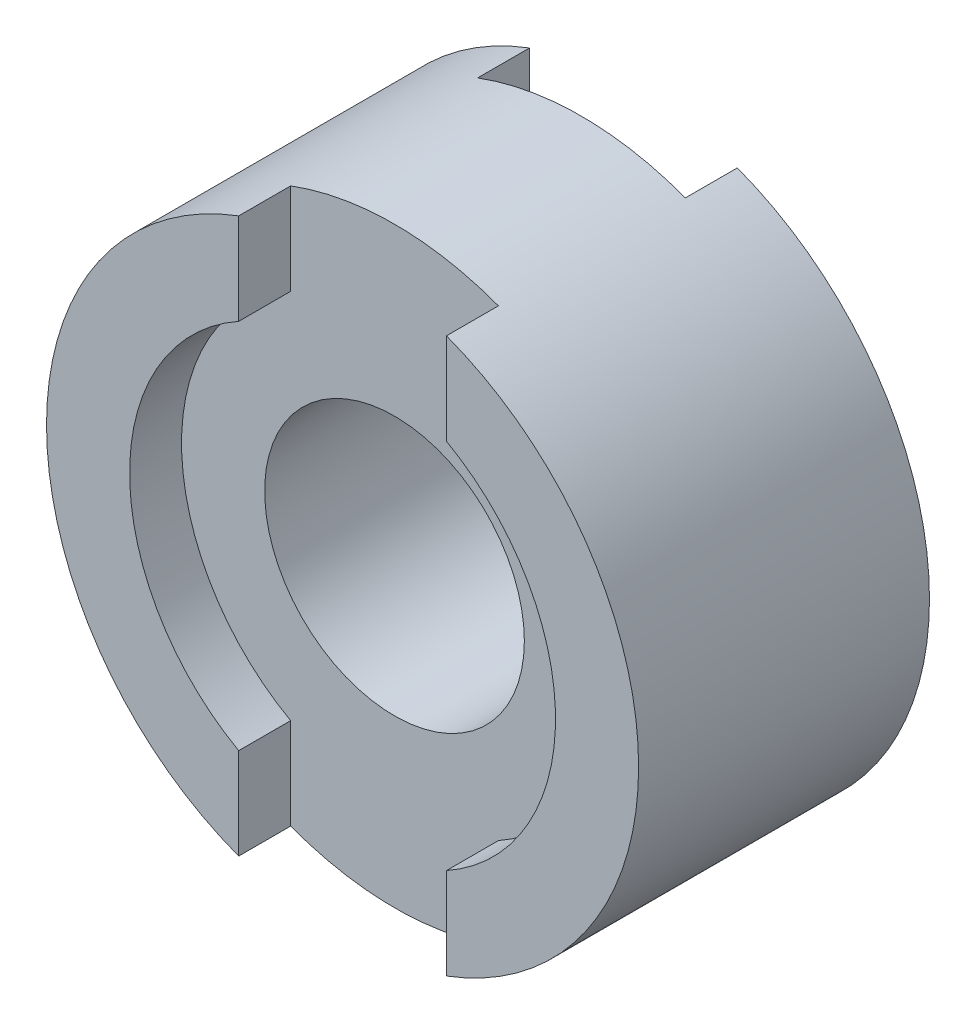
ISO-10303-21;
HEADER;
FILE_DESCRIPTION(('STEP AP214'),'2;1');
FILE_NAME('part.step','',(''),(''),'','','');
FILE_SCHEMA(('AUTOMOTIVE_DESIGN { 1 0 10303 214 1 1 1 1 }'));
ENDSEC;
DATA;
#1=APPLICATION_CONTEXT('core data for automotive mechanical design processes');
#2=APPLICATION_PROTOCOL_DEFINITION('international standard','automotive_design',2000,#1);
#3=PRODUCT_CONTEXT('',#1,'mechanical');
#4=PRODUCT('Part','Part','',(#3));
#5=PRODUCT_RELATED_PRODUCT_CATEGORY('part','',(#4));
#6=PRODUCT_DEFINITION_FORMATION('','',#4);
#7=PRODUCT_DEFINITION_CONTEXT('part definition',#1,'design');
#8=PRODUCT_DEFINITION('design','',#6,#7);
#9=PRODUCT_DEFINITION_SHAPE('','',#8);
#10=(LENGTH_UNIT() NAMED_UNIT(*) SI_UNIT(.MILLI.,.METRE.));
#11=(NAMED_UNIT(*) PLANE_ANGLE_UNIT() SI_UNIT($,.RADIAN.));
#12=(NAMED_UNIT(*) SI_UNIT($,.STERADIAN.) SOLID_ANGLE_UNIT());
#13=UNCERTAINTY_MEASURE_WITH_UNIT(LENGTH_MEASURE(1.E-05),#10,'distance_accuracy_value','');
#14=(GEOMETRIC_REPRESENTATION_CONTEXT(3) GLOBAL_UNCERTAINTY_ASSIGNED_CONTEXT((#13)) GLOBAL_UNIT_ASSIGNED_CONTEXT((#10,
#11,#12)) REPRESENTATION_CONTEXT('',''));
#15=CARTESIAN_POINT('',(0.,0.,0.));
#16=DIRECTION('',(0.,0.,1.));
#17=DIRECTION('',(1.,0.,0.));
#18=AXIS2_PLACEMENT_3D('',#15,#16,#17);
#19=CARTESIAN_POINT('',(0.,0.,-0.9));
#20=DIRECTION('',(0.,0.,-1.));
#21=DIRECTION('',(1.,0.,0.));
#22=AXIS2_PLACEMENT_3D('',#19,#20,#21);
#23=PLANE('',#22);
#24=DIRECTION('',(0.,-1.,0.));
#25=VECTOR('',#24,1.);
#26=CARTESIAN_POINT('',(1.,-1.78955301681733,-0.9));
#27=LINE('',#26,#25);
#28=CARTESIAN_POINT('',(1.,-1.78955301681733,-0.9));
#29=VERTEX_POINT('',#28);
#30=CARTESIAN_POINT('',(1.,-2.6688012290165,-0.9));
#31=VERTEX_POINT('',#30);
#32=EDGE_CURVE('E172',#29,#31,#27,.T.);
#33=ORIENTED_EDGE('',*,*,#32,.T.);
#34=CARTESIAN_POINT('',(0.,0.,-0.9));
#35=DIRECTION('',(0.,0.,1.));
#36=DIRECTION('',(1.,0.,0.));
#37=AXIS2_PLACEMENT_3D('',#34,#35,#36);
#38=CIRCLE('',#37,2.85);
#39=CARTESIAN_POINT('',(-0.999999999999999,-2.6688012290165,-0.9));
#40=VERTEX_POINT('',#39);
#41=EDGE_CURVE('E148',#40,#31,#38,.T.);
#42=ORIENTED_EDGE('',*,*,#41,.F.);
#43=DIRECTION('',(0.,1.,0.));
#44=VECTOR('',#43,1.);
#45=CARTESIAN_POINT('',(-1.,-1.78955301681733,-0.9));
#46=LINE('',#45,#44);
#47=CARTESIAN_POINT('',(-1.,-1.78955301681733,-0.9));
#48=VERTEX_POINT('',#47);
#49=EDGE_CURVE('E186',#40,#48,#46,.T.);
#50=ORIENTED_EDGE('',*,*,#49,.T.);
#51=CARTESIAN_POINT('',(0.,0.,-0.9));
#52=DIRECTION('',(0.,0.,-1.));
#53=DIRECTION('',(1.,0.,0.));
#54=AXIS2_PLACEMENT_3D('',#51,#52,#53);
#55=CIRCLE('',#54,2.05);
#56=CARTESIAN_POINT('',(-1.,1.78955301681733,-0.9));
#57=VERTEX_POINT('',#56);
#58=EDGE_CURVE('E198',#48,#57,#55,.T.);
#59=ORIENTED_EDGE('',*,*,#58,.T.);
#60=DIRECTION('',(0.,1.,0.));
#61=VECTOR('',#60,1.);
#62=CARTESIAN_POINT('',(-0.999999999999999,2.6688012290165,-0.9));
#63=LINE('',#62,#61);
#64=CARTESIAN_POINT('',(-0.999999999999999,2.6688012290165,-0.9));
#65=VERTEX_POINT('',#64);
#66=EDGE_CURVE('E153',#57,#65,#63,.T.);
#67=ORIENTED_EDGE('',*,*,#66,.T.);
#68=CARTESIAN_POINT('',(1.,2.6688012290165,-0.9));
#69=VERTEX_POINT('',#68);
#70=EDGE_CURVE('E54',#69,#65,#38,.T.);
#71=ORIENTED_EDGE('',*,*,#70,.F.);
#72=DIRECTION('',(0.,-1.,0.));
#73=VECTOR('',#72,1.);
#74=CARTESIAN_POINT('',(1.,2.6688012290165,-0.9));
#75=LINE('',#74,#73);
#76=CARTESIAN_POINT('',(1.,1.78955301681733,-0.9));
#77=VERTEX_POINT('',#76);
#78=EDGE_CURVE('E47',#69,#77,#75,.T.);
#79=ORIENTED_EDGE('',*,*,#78,.T.);
#80=CARTESIAN_POINT('',(0.,0.,-0.9));
#81=DIRECTION('',(0.,0.,-1.));
#82=DIRECTION('',(1.,0.,0.));
#83=AXIS2_PLACEMENT_3D('',#80,#81,#82);
#84=CIRCLE('',#83,2.05);
#85=EDGE_CURVE('E174',#77,#29,#84,.T.);
#86=ORIENTED_EDGE('',*,*,#85,.T.);
#87=EDGE_LOOP('',(#33,#42,#50,#59,#67,#71,#79,#86));
#88=FACE_BOUND('',#87,.T.);
#89=CARTESIAN_POINT('',(0.,0.,-0.9));
#90=DIRECTION('',(0.,0.,1.));
#91=DIRECTION('',(1.,0.,0.));
#92=AXIS2_PLACEMENT_3D('',#89,#90,#91);
#93=CIRCLE('',#92,1.25);
#94=CARTESIAN_POINT('',(1.25,0.,-0.9));
#95=VERTEX_POINT('',#94);
#96=EDGE_CURVE('E210',#95,#95,#93,.T.);
#97=ORIENTED_EDGE('',*,*,#96,.T.);
#98=EDGE_LOOP('',(#97));
#99=FACE_BOUND('',#98,.T.);
#100=ADVANCED_FACE('F32',(#88,#99),#23,.T.);
#101=CARTESIAN_POINT('',(0.,0.,0.9));
#102=DIRECTION('',(0.,0.,1.));
#103=DIRECTION('',(1.,0.,0.));
#104=AXIS2_PLACEMENT_3D('',#101,#102,#103);
#105=PLANE('',#104);
#106=CARTESIAN_POINT('',(0.,0.,0.9));
#107=DIRECTION('',(0.,0.,1.));
#108=DIRECTION('',(1.,0.,0.));
#109=AXIS2_PLACEMENT_3D('',#106,#107,#108);
#110=CIRCLE('',#109,1.25);
#111=CARTESIAN_POINT('',(1.25,0.,0.9));
#112=VERTEX_POINT('',#111);
#113=EDGE_CURVE('E273',#112,#112,#110,.T.);
#114=ORIENTED_EDGE('',*,*,#113,.F.);
#115=EDGE_LOOP('',(#114));
#116=FACE_BOUND('',#115,.T.);
#117=CARTESIAN_POINT('',(0.,0.,0.9));
#118=DIRECTION('',(0.,0.,-1.));
#119=DIRECTION('',(1.,0.,0.));
#120=AXIS2_PLACEMENT_3D('',#117,#118,#119);
#121=CIRCLE('',#120,2.05);
#122=CARTESIAN_POINT('',(1.,1.78955301681733,0.9));
#123=VERTEX_POINT('',#122);
#124=CARTESIAN_POINT('',(1.,-1.78955301681733,0.9));
#125=VERTEX_POINT('',#124);
#126=EDGE_CURVE('E228',#123,#125,#121,.T.);
#127=ORIENTED_EDGE('',*,*,#126,.F.);
#128=DIRECTION('',(0.,-1.,0.));
#129=VECTOR('',#128,1.);
#130=CARTESIAN_POINT('',(1.,2.6688012290165,0.9));
#131=LINE('',#130,#129);
#132=CARTESIAN_POINT('',(1.,2.6688012290165,0.9));
#133=VERTEX_POINT('',#132);
#134=EDGE_CURVE('E214',#133,#123,#131,.T.);
#135=ORIENTED_EDGE('',*,*,#134,.F.);
#136=CARTESIAN_POINT('',(0.,0.,0.9));
#137=DIRECTION('',(0.,0.,1.));
#138=DIRECTION('',(1.,0.,0.));
#139=AXIS2_PLACEMENT_3D('',#136,#137,#138);
#140=CIRCLE('',#139,2.85);
#141=CARTESIAN_POINT('',(-0.999999999999999,2.6688012290165,0.9));
#142=VERTEX_POINT('',#141);
#143=EDGE_CURVE('E40',#133,#142,#140,.T.);
#144=ORIENTED_EDGE('',*,*,#143,.T.);
#145=DIRECTION('',(0.,1.,0.));
#146=VECTOR('',#145,1.);
#147=CARTESIAN_POINT('',(-0.999999999999999,2.6688012290165,0.9));
#148=LINE('',#147,#146);
#149=CARTESIAN_POINT('',(-1.,1.78955301681733,0.9));
#150=VERTEX_POINT('',#149);
#151=EDGE_CURVE('E249',#150,#142,#148,.T.);
#152=ORIENTED_EDGE('',*,*,#151,.F.);
#153=CARTESIAN_POINT('',(0.,0.,0.9));
#154=DIRECTION('',(0.,0.,-1.));
#155=DIRECTION('',(1.,0.,0.));
#156=AXIS2_PLACEMENT_3D('',#153,#154,#155);
#157=CIRCLE('',#156,2.05);
#158=CARTESIAN_POINT('',(-1.,-1.78955301681733,0.9));
#159=VERTEX_POINT('',#158);
#160=EDGE_CURVE('E258',#159,#150,#157,.T.);
#161=ORIENTED_EDGE('',*,*,#160,.F.);
#162=DIRECTION('',(0.,1.,0.));
#163=VECTOR('',#162,1.);
#164=CARTESIAN_POINT('',(-1.,-1.78955301681733,0.9));
#165=LINE('',#164,#163);
#166=CARTESIAN_POINT('',(-0.999999999999999,-2.6688012290165,0.9));
#167=VERTEX_POINT('',#166);
#168=EDGE_CURVE('E244',#167,#159,#165,.T.);
#169=ORIENTED_EDGE('',*,*,#168,.F.);
#170=CARTESIAN_POINT('',(1.,-2.6688012290165,0.9));
#171=VERTEX_POINT('',#170);
#172=EDGE_CURVE('E11',#167,#171,#140,.T.);
#173=ORIENTED_EDGE('',*,*,#172,.T.);
#174=DIRECTION('',(0.,-1.,0.));
#175=VECTOR('',#174,1.);
#176=CARTESIAN_POINT('',(1.,-1.78955301681733,0.9));
#177=LINE('',#176,#175);
#178=EDGE_CURVE('E219',#125,#171,#177,.T.);
#179=ORIENTED_EDGE('',*,*,#178,.F.);
#180=EDGE_LOOP('',(#127,#135,#144,#152,#161,#169,#173,#179));
#181=FACE_BOUND('',#180,.T.);
#182=ADVANCED_FACE('F279',(#116,#181),#105,.T.);
#183=CARTESIAN_POINT('',(0.,0.,0.9));
#184=DIRECTION('',(0.,0.,-1.));
#185=DIRECTION('',(-1.,0.,0.));
#186=AXIS2_PLACEMENT_3D('',#183,#184,#185);
#187=CYLINDRICAL_SURFACE('',#186,2.85);
#188=ORIENTED_EDGE('',*,*,#172,.F.);
#189=DIRECTION('',(0.,0.,-1.));
#190=VECTOR('',#189,1.);
#191=CARTESIAN_POINT('',(-0.999999999999999,-2.6688012290165,1.4));
#192=LINE('',#191,#190);
#193=CARTESIAN_POINT('',(-0.999999999999999,-2.6688012290165,1.4));
#194=VERTEX_POINT('',#193);
#195=EDGE_CURVE('E271',#194,#167,#192,.T.);
#196=ORIENTED_EDGE('',*,*,#195,.F.);
#197=CARTESIAN_POINT('',(0.,0.,1.4));
#198=DIRECTION('',(0.,0.,1.));
#199=DIRECTION('',(1.,0.,0.));
#200=AXIS2_PLACEMENT_3D('',#197,#198,#199);
#201=CIRCLE('',#200,2.85);
#202=CARTESIAN_POINT('',(-0.999999999999999,2.6688012290165,1.4));
#203=VERTEX_POINT('',#202);
#204=EDGE_CURVE('E245',#203,#194,#201,.T.);
#205=ORIENTED_EDGE('',*,*,#204,.F.);
#206=DIRECTION('',(0.,0.,-1.));
#207=VECTOR('',#206,1.);
#208=CARTESIAN_POINT('',(-0.999999999999999,2.6688012290165,1.4));
#209=LINE('',#208,#207);
#210=EDGE_CURVE('E255',#203,#142,#209,.T.);
#211=ORIENTED_EDGE('',*,*,#210,.T.);
#212=ORIENTED_EDGE('',*,*,#143,.F.);
#213=DIRECTION('',(0.,0.,-1.));
#214=VECTOR('',#213,1.);
#215=CARTESIAN_POINT('',(1.,2.6688012290165,1.4));
#216=LINE('',#215,#214);
#217=CARTESIAN_POINT('',(1.,2.6688012290165,1.4));
#218=VERTEX_POINT('',#217);
#219=EDGE_CURVE('E241',#218,#133,#216,.T.);
#220=ORIENTED_EDGE('',*,*,#219,.F.);
#221=CARTESIAN_POINT('',(0.,0.,1.4));
#222=DIRECTION('',(0.,0.,1.));
#223=DIRECTION('',(1.,0.,0.));
#224=AXIS2_PLACEMENT_3D('',#221,#222,#223);
#225=CIRCLE('',#224,2.85);
#226=CARTESIAN_POINT('',(1.,-2.6688012290165,1.4));
#227=VERTEX_POINT('',#226);
#228=EDGE_CURVE('E215',#227,#218,#225,.T.);
#229=ORIENTED_EDGE('',*,*,#228,.F.);
#230=DIRECTION('',(0.,0.,-1.));
#231=VECTOR('',#230,1.);
#232=CARTESIAN_POINT('',(1.,-2.6688012290165,1.4));
#233=LINE('',#232,#231);
#234=EDGE_CURVE('E225',#227,#171,#233,.T.);
#235=ORIENTED_EDGE('',*,*,#234,.T.);
#236=EDGE_LOOP('',(#188,#196,#205,#211,#212,#220,#229,#235));
#237=FACE_BOUND('',#236,.T.);
#238=ORIENTED_EDGE('',*,*,#41,.T.);
#239=DIRECTION('',(0.,0.,1.));
#240=VECTOR('',#239,1.);
#241=CARTESIAN_POINT('',(1.,-2.6688012290165,-1.4));
#242=LINE('',#241,#240);
#243=CARTESIAN_POINT('',(1.,-2.6688012290165,-1.4));
#244=VERTEX_POINT('',#243);
#245=EDGE_CURVE('E143',#244,#31,#242,.T.);
#246=ORIENTED_EDGE('',*,*,#245,.F.);
#247=CARTESIAN_POINT('',(0.,0.,-1.4));
#248=DIRECTION('',(0.,0.,1.));
#249=DIRECTION('',(1.,0.,0.));
#250=AXIS2_PLACEMENT_3D('',#247,#248,#249);
#251=CIRCLE('',#250,2.85);
#252=CARTESIAN_POINT('',(1.,2.6688012290165,-1.4));
#253=VERTEX_POINT('',#252);
#254=EDGE_CURVE('E145',#244,#253,#251,.T.);
#255=ORIENTED_EDGE('',*,*,#254,.T.);
#256=DIRECTION('',(0.,0.,1.));
#257=VECTOR('',#256,1.);
#258=CARTESIAN_POINT('',(1.,2.6688012290165,-1.4));
#259=LINE('',#258,#257);
#260=EDGE_CURVE('E171',#253,#69,#259,.T.);
#261=ORIENTED_EDGE('',*,*,#260,.T.);
#262=ORIENTED_EDGE('',*,*,#70,.T.);
#263=DIRECTION('',(0.,0.,1.));
#264=VECTOR('',#263,1.);
#265=CARTESIAN_POINT('',(-0.999999999999999,2.6688012290165,-1.4));
#266=LINE('',#265,#264);
#267=CARTESIAN_POINT('',(-0.999999999999999,2.6688012290165,-1.4));
#268=VERTEX_POINT('',#267);
#269=EDGE_CURVE('E208',#268,#65,#266,.T.);
#270=ORIENTED_EDGE('',*,*,#269,.F.);
#271=CARTESIAN_POINT('',(0.,0.,-1.4));
#272=DIRECTION('',(0.,0.,1.));
#273=DIRECTION('',(1.,0.,0.));
#274=AXIS2_PLACEMENT_3D('',#271,#272,#273);
#275=CIRCLE('',#274,2.85);
#276=CARTESIAN_POINT('',(-0.999999999999999,-2.6688012290165,-1.4));
#277=VERTEX_POINT('',#276);
#278=EDGE_CURVE('E182',#268,#277,#275,.T.);
#279=ORIENTED_EDGE('',*,*,#278,.T.);
#280=DIRECTION('',(0.,0.,1.));
#281=VECTOR('',#280,1.);
#282=CARTESIAN_POINT('',(-0.999999999999999,-2.6688012290165,-1.4));
#283=LINE('',#282,#281);
#284=EDGE_CURVE('E195',#277,#40,#283,.T.);
#285=ORIENTED_EDGE('',*,*,#284,.T.);
#286=EDGE_LOOP('',(#238,#246,#255,#261,#262,#270,#279,#285));
#287=FACE_BOUND('',#286,.T.);
#288=ADVANCED_FACE('F34',(#237,#287),#187,.T.);
#289=CARTESIAN_POINT('',(0.,0.,0.9));
#290=DIRECTION('',(0.,0.,-1.));
#291=DIRECTION('',(-1.,0.,0.));
#292=AXIS2_PLACEMENT_3D('',#289,#290,#291);
#293=CYLINDRICAL_SURFACE('',#292,1.25);
#294=ORIENTED_EDGE('',*,*,#113,.T.);
#295=EDGE_LOOP('',(#294));
#296=FACE_BOUND('',#295,.T.);
#297=ORIENTED_EDGE('',*,*,#96,.F.);
#298=EDGE_LOOP('',(#297));
#299=FACE_BOUND('',#298,.T.);
#300=ADVANCED_FACE('F299',(#296,#299),#293,.F.);
#301=CARTESIAN_POINT('',(-1.,-1.78955301681733,1.4));
#302=DIRECTION('',(-1.,0.,0.));
#303=DIRECTION('',(0.,-1.,0.));
#304=AXIS2_PLACEMENT_3D('',#301,#302,#303);
#305=PLANE('',#304);
#306=ORIENTED_EDGE('',*,*,#168,.T.);
#307=DIRECTION('',(0.,0.,-1.));
#308=VECTOR('',#307,1.);
#309=CARTESIAN_POINT('',(-1.,-1.78955301681733,1.4));
#310=LINE('',#309,#308);
#311=CARTESIAN_POINT('',(-1.,-1.78955301681733,1.4));
#312=VERTEX_POINT('',#311);
#313=EDGE_CURVE('E268',#312,#159,#310,.T.);
#314=ORIENTED_EDGE('',*,*,#313,.F.);
#315=DIRECTION('',(0.,1.,0.));
#316=VECTOR('',#315,1.);
#317=CARTESIAN_POINT('',(-1.,-1.78955301681733,1.4));
#318=LINE('',#317,#316);
#319=EDGE_CURVE('E248',#194,#312,#318,.T.);
#320=ORIENTED_EDGE('',*,*,#319,.F.);
#321=ORIENTED_EDGE('',*,*,#195,.T.);
#322=EDGE_LOOP('',(#306,#314,#320,#321));
#323=FACE_BOUND('',#322,.T.);
#324=ADVANCED_FACE('F297',(#323),#305,.F.);
#325=CARTESIAN_POINT('',(0.,0.,1.4));
#326=DIRECTION('',(0.,0.,-1.));
#327=DIRECTION('',(-1.,0.,0.));
#328=AXIS2_PLACEMENT_3D('',#325,#326,#327);
#329=CYLINDRICAL_SURFACE('',#328,2.05);
#330=ORIENTED_EDGE('',*,*,#160,.T.);
#331=DIRECTION('',(0.,0.,-1.));
#332=VECTOR('',#331,1.);
#333=CARTESIAN_POINT('',(-1.,1.78955301681733,1.4));
#334=LINE('',#333,#332);
#335=CARTESIAN_POINT('',(-1.,1.78955301681733,1.4));
#336=VERTEX_POINT('',#335);
#337=EDGE_CURVE('E265',#336,#150,#334,.T.);
#338=ORIENTED_EDGE('',*,*,#337,.F.);
#339=CARTESIAN_POINT('',(0.,0.,1.4));
#340=DIRECTION('',(0.,0.,-1.));
#341=DIRECTION('',(1.,0.,0.));
#342=AXIS2_PLACEMENT_3D('',#339,#340,#341);
#343=CIRCLE('',#342,2.05);
#344=EDGE_CURVE('E251',#312,#336,#343,.T.);
#345=ORIENTED_EDGE('',*,*,#344,.F.);
#346=ORIENTED_EDGE('',*,*,#313,.T.);
#347=EDGE_LOOP('',(#330,#338,#345,#346));
#348=FACE_BOUND('',#347,.T.);
#349=ADVANCED_FACE('F295',(#348),#329,.F.);
#350=CARTESIAN_POINT('',(-0.999999999999999,2.6688012290165,1.4));
#351=DIRECTION('',(-1.,0.,0.));
#352=DIRECTION('',(0.,-1.,0.));
#353=AXIS2_PLACEMENT_3D('',#350,#351,#352);
#354=PLANE('',#353);
#355=ORIENTED_EDGE('',*,*,#151,.T.);
#356=ORIENTED_EDGE('',*,*,#210,.F.);
#357=DIRECTION('',(0.,1.,0.));
#358=VECTOR('',#357,1.);
#359=CARTESIAN_POINT('',(-0.999999999999999,2.6688012290165,1.4));
#360=LINE('',#359,#358);
#361=EDGE_CURVE('E253',#336,#203,#360,.T.);
#362=ORIENTED_EDGE('',*,*,#361,.F.);
#363=ORIENTED_EDGE('',*,*,#337,.T.);
#364=EDGE_LOOP('',(#355,#356,#362,#363));
#365=FACE_BOUND('',#364,.T.);
#366=ADVANCED_FACE('F284',(#365),#354,.F.);
#367=CARTESIAN_POINT('',(0.,0.,1.4));
#368=DIRECTION('',(0.,0.,1.));
#369=DIRECTION('',(1.,0.,0.));
#370=AXIS2_PLACEMENT_3D('',#367,#368,#369);
#371=PLANE('',#370);
#372=ORIENTED_EDGE('',*,*,#204,.T.);
#373=ORIENTED_EDGE('',*,*,#319,.T.);
#374=ORIENTED_EDGE('',*,*,#344,.T.);
#375=ORIENTED_EDGE('',*,*,#361,.T.);
#376=EDGE_LOOP('',(#372,#373,#374,#375));
#377=FACE_BOUND('',#376,.T.);
#378=ADVANCED_FACE('F291',(#377),#371,.T.);
#379=CARTESIAN_POINT('',(1.,2.6688012290165,1.4));
#380=DIRECTION('',(1.,0.,0.));
#381=DIRECTION('',(0.,1.,0.));
#382=AXIS2_PLACEMENT_3D('',#379,#380,#381);
#383=PLANE('',#382);
#384=ORIENTED_EDGE('',*,*,#134,.T.);
#385=DIRECTION('',(0.,0.,-1.));
#386=VECTOR('',#385,1.);
#387=CARTESIAN_POINT('',(1.,1.78955301681733,1.4));
#388=LINE('',#387,#386);
#389=CARTESIAN_POINT('',(1.,1.78955301681733,1.4));
#390=VERTEX_POINT('',#389);
#391=EDGE_CURVE('E238',#390,#123,#388,.T.);
#392=ORIENTED_EDGE('',*,*,#391,.F.);
#393=DIRECTION('',(0.,-1.,0.));
#394=VECTOR('',#393,1.);
#395=CARTESIAN_POINT('',(1.,2.6688012290165,1.4));
#396=LINE('',#395,#394);
#397=EDGE_CURVE('E218',#218,#390,#396,.T.);
#398=ORIENTED_EDGE('',*,*,#397,.F.);
#399=ORIENTED_EDGE('',*,*,#219,.T.);
#400=EDGE_LOOP('',(#384,#392,#398,#399));
#401=FACE_BOUND('',#400,.T.);
#402=ADVANCED_FACE('F330',(#401),#383,.F.);
#403=CARTESIAN_POINT('',(0.,0.,1.4));
#404=DIRECTION('',(0.,0.,-1.));
#405=DIRECTION('',(-1.,0.,0.));
#406=AXIS2_PLACEMENT_3D('',#403,#404,#405);
#407=CYLINDRICAL_SURFACE('',#406,2.05);
#408=ORIENTED_EDGE('',*,*,#126,.T.);
#409=DIRECTION('',(0.,0.,-1.));
#410=VECTOR('',#409,1.);
#411=CARTESIAN_POINT('',(1.,-1.78955301681733,1.4));
#412=LINE('',#411,#410);
#413=CARTESIAN_POINT('',(1.,-1.78955301681733,1.4));
#414=VERTEX_POINT('',#413);
#415=EDGE_CURVE('E235',#414,#125,#412,.T.);
#416=ORIENTED_EDGE('',*,*,#415,.F.);
#417=CARTESIAN_POINT('',(0.,0.,1.4));
#418=DIRECTION('',(0.,0.,-1.));
#419=DIRECTION('',(1.,0.,0.));
#420=AXIS2_PLACEMENT_3D('',#417,#418,#419);
#421=CIRCLE('',#420,2.05);
#422=EDGE_CURVE('E221',#390,#414,#421,.T.);
#423=ORIENTED_EDGE('',*,*,#422,.F.);
#424=ORIENTED_EDGE('',*,*,#391,.T.);
#425=EDGE_LOOP('',(#408,#416,#423,#424));
#426=FACE_BOUND('',#425,.T.);
#427=ADVANCED_FACE('F326',(#426),#407,.F.);
#428=CARTESIAN_POINT('',(1.,-1.78955301681733,1.4));
#429=DIRECTION('',(1.,0.,0.));
#430=DIRECTION('',(0.,1.,0.));
#431=AXIS2_PLACEMENT_3D('',#428,#429,#430);
#432=PLANE('',#431);
#433=ORIENTED_EDGE('',*,*,#178,.T.);
#434=ORIENTED_EDGE('',*,*,#234,.F.);
#435=DIRECTION('',(0.,-1.,0.));
#436=VECTOR('',#435,1.);
#437=CARTESIAN_POINT('',(1.,-1.78955301681733,1.4));
#438=LINE('',#437,#436);
#439=EDGE_CURVE('E223',#414,#227,#438,.T.);
#440=ORIENTED_EDGE('',*,*,#439,.F.);
#441=ORIENTED_EDGE('',*,*,#415,.T.);
#442=EDGE_LOOP('',(#433,#434,#440,#441));
#443=FACE_BOUND('',#442,.T.);
#444=ADVANCED_FACE('F322',(#443),#432,.F.);
#445=CARTESIAN_POINT('',(0.,0.,1.4));
#446=DIRECTION('',(0.,0.,1.));
#447=DIRECTION('',(1.,0.,0.));
#448=AXIS2_PLACEMENT_3D('',#445,#446,#447);
#449=PLANE('',#448);
#450=ORIENTED_EDGE('',*,*,#228,.T.);
#451=ORIENTED_EDGE('',*,*,#397,.T.);
#452=ORIENTED_EDGE('',*,*,#422,.T.);
#453=ORIENTED_EDGE('',*,*,#439,.T.);
#454=EDGE_LOOP('',(#450,#451,#452,#453));
#455=FACE_BOUND('',#454,.T.);
#456=ADVANCED_FACE('F319',(#455),#449,.T.);
#457=CARTESIAN_POINT('',(-0.999999999999999,2.6688012290165,-1.4));
#458=DIRECTION('',(1.,0.,0.));
#459=DIRECTION('',(0.,1.,0.));
#460=AXIS2_PLACEMENT_3D('',#457,#458,#459);
#461=PLANE('',#460);
#462=ORIENTED_EDGE('',*,*,#66,.F.);
#463=DIRECTION('',(0.,0.,1.));
#464=VECTOR('',#463,1.);
#465=CARTESIAN_POINT('',(-1.,1.78955301681733,-1.4));
#466=LINE('',#465,#464);
#467=CARTESIAN_POINT('',(-1.,1.78955301681733,-1.4));
#468=VERTEX_POINT('',#467);
#469=EDGE_CURVE('E206',#468,#57,#466,.T.);
#470=ORIENTED_EDGE('',*,*,#469,.F.);
#471=DIRECTION('',(0.,1.,0.));
#472=VECTOR('',#471,1.);
#473=CARTESIAN_POINT('',(-0.999999999999999,2.6688012290165,-1.4));
#474=LINE('',#473,#472);
#475=EDGE_CURVE('E185',#468,#268,#474,.T.);
#476=ORIENTED_EDGE('',*,*,#475,.T.);
#477=ORIENTED_EDGE('',*,*,#269,.T.);
#478=EDGE_LOOP('',(#462,#470,#476,#477));
#479=FACE_BOUND('',#478,.T.);
#480=ADVANCED_FACE('F317',(#479),#461,.T.);
#481=CARTESIAN_POINT('',(0.,0.,-1.4));
#482=DIRECTION('',(0.,0.,1.));
#483=DIRECTION('',(1.,0.,0.));
#484=AXIS2_PLACEMENT_3D('',#481,#482,#483);
#485=CYLINDRICAL_SURFACE('',#484,2.05);
#486=ORIENTED_EDGE('',*,*,#58,.F.);
#487=DIRECTION('',(0.,0.,1.));
#488=VECTOR('',#487,1.);
#489=CARTESIAN_POINT('',(-1.,-1.78955301681733,-1.4));
#490=LINE('',#489,#488);
#491=CARTESIAN_POINT('',(-1.,-1.78955301681733,-1.4));
#492=VERTEX_POINT('',#491);
#493=EDGE_CURVE('E204',#492,#48,#490,.T.);
#494=ORIENTED_EDGE('',*,*,#493,.F.);
#495=CARTESIAN_POINT('',(0.,0.,-1.4));
#496=DIRECTION('',(0.,0.,-1.));
#497=DIRECTION('',(1.,0.,0.));
#498=AXIS2_PLACEMENT_3D('',#495,#496,#497);
#499=CIRCLE('',#498,2.05);
#500=EDGE_CURVE('E189',#492,#468,#499,.T.);
#501=ORIENTED_EDGE('',*,*,#500,.T.);
#502=ORIENTED_EDGE('',*,*,#469,.T.);
#503=EDGE_LOOP('',(#486,#494,#501,#502));
#504=FACE_BOUND('',#503,.T.);
#505=ADVANCED_FACE('F368',(#504),#485,.F.);
#506=CARTESIAN_POINT('',(-1.,-1.78955301681733,-1.4));
#507=DIRECTION('',(1.,0.,0.));
#508=DIRECTION('',(0.,1.,0.));
#509=AXIS2_PLACEMENT_3D('',#506,#507,#508);
#510=PLANE('',#509);
#511=ORIENTED_EDGE('',*,*,#49,.F.);
#512=ORIENTED_EDGE('',*,*,#284,.F.);
#513=DIRECTION('',(0.,1.,0.));
#514=VECTOR('',#513,1.);
#515=CARTESIAN_POINT('',(-1.,-1.78955301681733,-1.4));
#516=LINE('',#515,#514);
#517=EDGE_CURVE('E192',#277,#492,#516,.T.);
#518=ORIENTED_EDGE('',*,*,#517,.T.);
#519=ORIENTED_EDGE('',*,*,#493,.T.);
#520=EDGE_LOOP('',(#511,#512,#518,#519));
#521=FACE_BOUND('',#520,.T.);
#522=ADVANCED_FACE('F376',(#521),#510,.T.);
#523=CARTESIAN_POINT('',(0.,0.,-1.4));
#524=DIRECTION('',(0.,0.,-1.));
#525=DIRECTION('',(1.,0.,0.));
#526=AXIS2_PLACEMENT_3D('',#523,#524,#525);
#527=PLANE('',#526);
#528=ORIENTED_EDGE('',*,*,#278,.F.);
#529=ORIENTED_EDGE('',*,*,#475,.F.);
#530=ORIENTED_EDGE('',*,*,#500,.F.);
#531=ORIENTED_EDGE('',*,*,#517,.F.);
#532=EDGE_LOOP('',(#528,#529,#530,#531));
#533=FACE_BOUND('',#532,.T.);
#534=ADVANCED_FACE('F383',(#533),#527,.T.);
#535=CARTESIAN_POINT('',(1.,-1.78955301681733,-1.4));
#536=DIRECTION('',(-1.,0.,0.));
#537=DIRECTION('',(0.,-1.,0.));
#538=AXIS2_PLACEMENT_3D('',#535,#536,#537);
#539=PLANE('',#538);
#540=ORIENTED_EDGE('',*,*,#32,.F.);
#541=DIRECTION('',(0.,0.,1.));
#542=VECTOR('',#541,1.);
#543=CARTESIAN_POINT('',(1.,-1.78955301681733,-1.4));
#544=LINE('',#543,#542);
#545=CARTESIAN_POINT('',(1.,-1.78955301681733,-1.4));
#546=VERTEX_POINT('',#545);
#547=EDGE_CURVE('E154',#546,#29,#544,.T.);
#548=ORIENTED_EDGE('',*,*,#547,.F.);
#549=DIRECTION('',(0.,-1.,0.));
#550=VECTOR('',#549,1.);
#551=CARTESIAN_POINT('',(1.,-1.78955301681733,-1.4));
#552=LINE('',#551,#550);
#553=EDGE_CURVE('E160',#546,#244,#552,.T.);
#554=ORIENTED_EDGE('',*,*,#553,.T.);
#555=ORIENTED_EDGE('',*,*,#245,.T.);
#556=EDGE_LOOP('',(#540,#548,#554,#555));
#557=FACE_BOUND('',#556,.T.);
#558=ADVANCED_FACE('F165',(#557),#539,.T.);
#559=CARTESIAN_POINT('',(0.,0.,-1.4));
#560=DIRECTION('',(0.,0.,1.));
#561=DIRECTION('',(1.,0.,0.));
#562=AXIS2_PLACEMENT_3D('',#559,#560,#561);
#563=CYLINDRICAL_SURFACE('',#562,2.05);
#564=ORIENTED_EDGE('',*,*,#85,.F.);
#565=DIRECTION('',(0.,0.,1.));
#566=VECTOR('',#565,1.);
#567=CARTESIAN_POINT('',(1.,1.78955301681733,-1.4));
#568=LINE('',#567,#566);
#569=CARTESIAN_POINT('',(1.,1.78955301681733,-1.4));
#570=VERTEX_POINT('',#569);
#571=EDGE_CURVE('E179',#570,#77,#568,.T.);
#572=ORIENTED_EDGE('',*,*,#571,.F.);
#573=CARTESIAN_POINT('',(0.,0.,-1.4));
#574=DIRECTION('',(0.,0.,-1.));
#575=DIRECTION('',(1.,0.,0.));
#576=AXIS2_PLACEMENT_3D('',#573,#574,#575);
#577=CIRCLE('',#576,2.05);
#578=EDGE_CURVE('E166',#570,#546,#577,.T.);
#579=ORIENTED_EDGE('',*,*,#578,.T.);
#580=ORIENTED_EDGE('',*,*,#547,.T.);
#581=EDGE_LOOP('',(#564,#572,#579,#580));
#582=FACE_BOUND('',#581,.T.);
#583=ADVANCED_FACE('F398',(#582),#563,.F.);
#584=CARTESIAN_POINT('',(1.,2.6688012290165,-1.4));
#585=DIRECTION('',(-1.,0.,0.));
#586=DIRECTION('',(0.,-1.,0.));
#587=AXIS2_PLACEMENT_3D('',#584,#585,#586);
#588=PLANE('',#587);
#589=ORIENTED_EDGE('',*,*,#78,.F.);
#590=ORIENTED_EDGE('',*,*,#260,.F.);
#591=DIRECTION('',(0.,-1.,0.));
#592=VECTOR('',#591,1.);
#593=CARTESIAN_POINT('',(1.,2.6688012290165,-1.4));
#594=LINE('',#593,#592);
#595=EDGE_CURVE('E163',#253,#570,#594,.T.);
#596=ORIENTED_EDGE('',*,*,#595,.T.);
#597=ORIENTED_EDGE('',*,*,#571,.T.);
#598=EDGE_LOOP('',(#589,#590,#596,#597));
#599=FACE_BOUND('',#598,.T.);
#600=ADVANCED_FACE('F405',(#599),#588,.T.);
#601=CARTESIAN_POINT('',(0.,0.,-1.4));
#602=DIRECTION('',(0.,0.,-1.));
#603=DIRECTION('',(1.,0.,0.));
#604=AXIS2_PLACEMENT_3D('',#601,#602,#603);
#605=PLANE('',#604);
#606=ORIENTED_EDGE('',*,*,#254,.F.);
#607=ORIENTED_EDGE('',*,*,#553,.F.);
#608=ORIENTED_EDGE('',*,*,#578,.F.);
#609=ORIENTED_EDGE('',*,*,#595,.F.);
#610=EDGE_LOOP('',(#606,#607,#608,#609));
#611=FACE_BOUND('',#610,.T.);
#612=ADVANCED_FACE('F158',(#611),#605,.T.);
#613=CLOSED_SHELL('',(#100,#182,#288,#300,#324,#349,#366,#378,#402,#427,#444,#456,#480,#505,
#522,#534,#558,#583,#600,#612));
#614=MANIFOLD_SOLID_BREP('B2',#613);
#615=ADVANCED_BREP_SHAPE_REPRESENTATION('',(#18,#614),#14);
#616=SHAPE_DEFINITION_REPRESENTATION(#9,#615);
ENDSEC;
END-ISO-10303-21;
